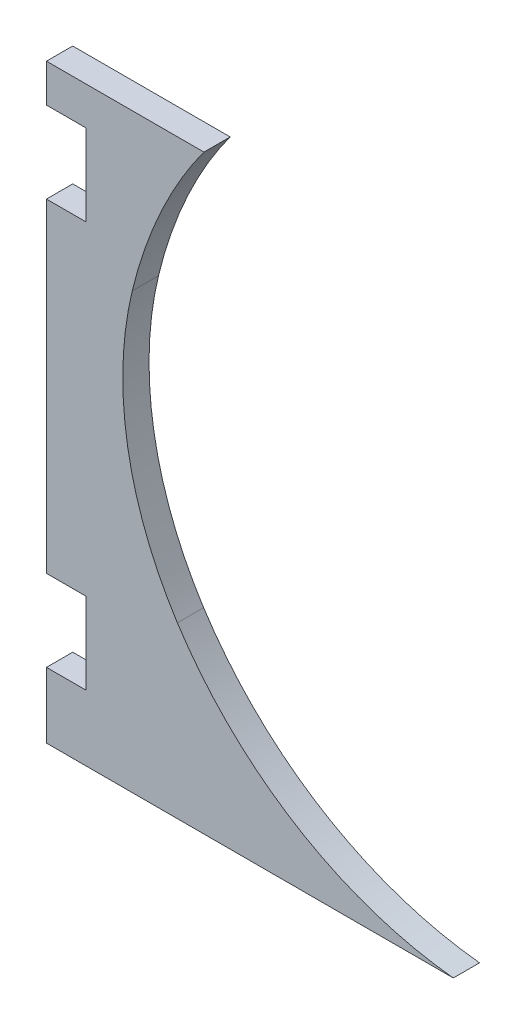
ISO-10303-21;
HEADER;
FILE_DESCRIPTION(('STEP AP214'),'2;1');
FILE_NAME('part.step','',(''),(''),'','','');
FILE_SCHEMA(('AUTOMOTIVE_DESIGN { 1 0 10303 214 1 1 1 1 }'));
ENDSEC;
DATA;
#1=APPLICATION_CONTEXT('core data for automotive mechanical design processes');
#2=APPLICATION_PROTOCOL_DEFINITION('international standard','automotive_design',2000,#1);
#3=PRODUCT_CONTEXT('',#1,'mechanical');
#4=PRODUCT('Part','Part','',(#3));
#5=PRODUCT_RELATED_PRODUCT_CATEGORY('part','',(#4));
#6=PRODUCT_DEFINITION_FORMATION('','',#4);
#7=PRODUCT_DEFINITION_CONTEXT('part definition',#1,'design');
#8=PRODUCT_DEFINITION('design','',#6,#7);
#9=PRODUCT_DEFINITION_SHAPE('','',#8);
#10=(LENGTH_UNIT() NAMED_UNIT(*) SI_UNIT(.MILLI.,.METRE.));
#11=(NAMED_UNIT(*) PLANE_ANGLE_UNIT() SI_UNIT($,.RADIAN.));
#12=(NAMED_UNIT(*) SI_UNIT($,.STERADIAN.) SOLID_ANGLE_UNIT());
#13=UNCERTAINTY_MEASURE_WITH_UNIT(LENGTH_MEASURE(1.E-05),#10,'distance_accuracy_value','');
#14=(GEOMETRIC_REPRESENTATION_CONTEXT(3) GLOBAL_UNCERTAINTY_ASSIGNED_CONTEXT((#13)) GLOBAL_UNIT_ASSIGNED_CONTEXT((#10,
#11,#12)) REPRESENTATION_CONTEXT('',''));
#15=CARTESIAN_POINT('',(0.,0.,0.));
#16=DIRECTION('',(0.,0.,1.));
#17=DIRECTION('',(1.,0.,0.));
#18=AXIS2_PLACEMENT_3D('',#15,#16,#17);
#19=CARTESIAN_POINT('',(-85.,0.,0.));
#20=DIRECTION('',(-1.,0.,0.));
#21=DIRECTION('',(0.,-1.,0.));
#22=AXIS2_PLACEMENT_3D('',#19,#20,#21);
#23=PLANE('',#22);
#24=DIRECTION('',(0.,0.,-1.));
#25=VECTOR('',#24,1.);
#26=CARTESIAN_POINT('',(-85.,67.,10.));
#27=LINE('',#26,#25);
#28=CARTESIAN_POINT('',(-85.,67.,10.));
#29=VERTEX_POINT('',#28);
#30=CARTESIAN_POINT('',(-85.,67.,0.));
#31=VERTEX_POINT('',#30);
#32=EDGE_CURVE('E165',#29,#31,#27,.T.);
#33=ORIENTED_EDGE('',*,*,#32,.T.);
#34=DIRECTION('',(0.,-1.,0.));
#35=VECTOR('',#34,1.);
#36=CARTESIAN_POINT('',(-85.,112.5,0.));
#37=LINE('',#36,#35);
#38=CARTESIAN_POINT('',(-85.,-56.5,0.));
#39=VERTEX_POINT('',#38);
#40=EDGE_CURVE('E198',#31,#39,#37,.T.);
#41=ORIENTED_EDGE('',*,*,#40,.T.);
#42=DIRECTION('',(0.,0.,-1.));
#43=VECTOR('',#42,1.);
#44=CARTESIAN_POINT('',(-85.,-56.5,10.));
#45=LINE('',#44,#43);
#46=CARTESIAN_POINT('',(-85.,-56.5,10.));
#47=VERTEX_POINT('',#46);
#48=EDGE_CURVE('E179',#47,#39,#45,.T.);
#49=ORIENTED_EDGE('',*,*,#48,.F.);
#50=DIRECTION('',(0.,1.,0.));
#51=VECTOR('',#50,1.);
#52=CARTESIAN_POINT('',(-85.,112.5,10.));
#53=LINE('',#52,#51);
#54=EDGE_CURVE('E205',#47,#29,#53,.T.);
#55=ORIENTED_EDGE('',*,*,#54,.T.);
#56=EDGE_LOOP('',(#33,#41,#49,#55));
#57=FACE_BOUND('',#56,.T.);
#58=ADVANCED_FACE('F35',(#57),#23,.T.);
#59=DIRECTION('',(0.,0.,-1.));
#60=VECTOR('',#59,1.);
#61=CARTESIAN_POINT('',(-85.,-87.5,10.));
#62=LINE('',#61,#60);
#63=CARTESIAN_POINT('',(-85.,-87.5,10.));
#64=VERTEX_POINT('',#63);
#65=CARTESIAN_POINT('',(-85.,-87.5,0.));
#66=VERTEX_POINT('',#65);
#67=EDGE_CURVE('E163',#64,#66,#62,.T.);
#68=ORIENTED_EDGE('',*,*,#67,.T.);
#69=CARTESIAN_POINT('',(-85.,-112.5,0.));
#70=VERTEX_POINT('',#69);
#71=EDGE_CURVE('E168',#66,#70,#37,.T.);
#72=ORIENTED_EDGE('',*,*,#71,.T.);
#73=DIRECTION('',(0.,0.,1.));
#74=VECTOR('',#73,1.);
#75=CARTESIAN_POINT('',(-85.,-112.5,0.));
#76=LINE('',#75,#74);
#77=CARTESIAN_POINT('',(-85.,-112.5,10.));
#78=VERTEX_POINT('',#77);
#79=EDGE_CURVE('E197',#70,#78,#76,.T.);
#80=ORIENTED_EDGE('',*,*,#79,.T.);
#81=EDGE_CURVE('E201',#78,#64,#53,.T.);
#82=ORIENTED_EDGE('',*,*,#81,.T.);
#83=EDGE_LOOP('',(#68,#72,#80,#82));
#84=FACE_BOUND('',#83,.T.);
#85=ADVANCED_FACE('F239',(#84),#23,.T.);
#86=CARTESIAN_POINT('',(-70.,112.5,10.));
#87=DIRECTION('',(0.,-1.,0.));
#88=DIRECTION('',(0.,0.,-1.));
#89=AXIS2_PLACEMENT_3D('',#86,#87,#88);
#90=PLANE('',#89);
#91=DIRECTION('',(0.,0.,1.));
#92=VECTOR('',#91,1.);
#93=CARTESIAN_POINT('',(-25.,112.5,0.));
#94=LINE('',#93,#92);
#95=CARTESIAN_POINT('',(-25.,112.5,0.));
#96=VERTEX_POINT('',#95);
#97=CARTESIAN_POINT('',(-25.,112.5,10.));
#98=VERTEX_POINT('',#97);
#99=EDGE_CURVE('E308',#96,#98,#94,.T.);
#100=ORIENTED_EDGE('',*,*,#99,.F.);
#101=DIRECTION('',(-1.,0.,0.));
#102=VECTOR('',#101,1.);
#103=CARTESIAN_POINT('',(-70.,112.5,0.));
#104=LINE('',#103,#102);
#105=CARTESIAN_POINT('',(-85.,112.5,0.));
#106=VERTEX_POINT('',#105);
#107=EDGE_CURVE('E288',#96,#106,#104,.T.);
#108=ORIENTED_EDGE('',*,*,#107,.T.);
#109=DIRECTION('',(0.,0.,-1.));
#110=VECTOR('',#109,1.);
#111=CARTESIAN_POINT('',(-85.,112.5,0.));
#112=LINE('',#111,#110);
#113=CARTESIAN_POINT('',(-85.,112.5,10.));
#114=VERTEX_POINT('',#113);
#115=EDGE_CURVE('E204',#114,#106,#112,.T.);
#116=ORIENTED_EDGE('',*,*,#115,.F.);
#117=DIRECTION('',(-1.,0.,0.));
#118=VECTOR('',#117,1.);
#119=CARTESIAN_POINT('',(-70.,112.5,10.));
#120=LINE('',#119,#118);
#121=EDGE_CURVE('E287',#98,#114,#120,.T.);
#122=ORIENTED_EDGE('',*,*,#121,.F.);
#123=EDGE_LOOP('',(#100,#108,#116,#122));
#124=FACE_BOUND('',#123,.T.);
#125=ADVANCED_FACE('F236',(#124),#90,.F.);
#126=CARTESIAN_POINT('',(-70.,-112.5,10.));
#127=DIRECTION('',(0.,1.,0.));
#128=DIRECTION('',(0.,0.,1.));
#129=AXIS2_PLACEMENT_3D('',#126,#127,#128);
#130=PLANE('',#129);
#131=DIRECTION('',(1.,0.,0.));
#132=VECTOR('',#131,1.);
#133=CARTESIAN_POINT('',(-70.,-112.5,0.));
#134=LINE('',#133,#132);
#135=CARTESIAN_POINT('',(70.,-112.5,0.));
#136=VERTEX_POINT('',#135);
#137=EDGE_CURVE('E283',#70,#136,#134,.T.);
#138=ORIENTED_EDGE('',*,*,#137,.T.);
#139=DIRECTION('',(0.,0.,-1.));
#140=VECTOR('',#139,1.);
#141=CARTESIAN_POINT('',(70.,-112.5,10.));
#142=LINE('',#141,#140);
#143=CARTESIAN_POINT('',(70.,-112.5,10.));
#144=VERTEX_POINT('',#143);
#145=EDGE_CURVE('E293',#144,#136,#142,.T.);
#146=ORIENTED_EDGE('',*,*,#145,.F.);
#147=DIRECTION('',(1.,0.,0.));
#148=VECTOR('',#147,1.);
#149=CARTESIAN_POINT('',(-70.,-112.5,10.));
#150=LINE('',#149,#148);
#151=EDGE_CURVE('E291',#78,#144,#150,.T.);
#152=ORIENTED_EDGE('',*,*,#151,.F.);
#153=ORIENTED_EDGE('',*,*,#79,.F.);
#154=EDGE_LOOP('',(#138,#146,#152,#153));
#155=FACE_BOUND('',#154,.T.);
#156=ADVANCED_FACE('F231',(#155),#130,.F.);
#157=CARTESIAN_POINT('',(0.,0.,10.));
#158=DIRECTION('',(0.,0.,1.));
#159=DIRECTION('',(1.,0.,0.));
#160=AXIS2_PLACEMENT_3D('',#157,#158,#159);
#161=PLANE('',#160);
#162=DIRECTION('',(-1.,0.,0.));
#163=VECTOR('',#162,1.);
#164=CARTESIAN_POINT('',(-85.,67.,10.));
#165=LINE('',#164,#163);
#166=CARTESIAN_POINT('',(-70.,67.,10.));
#167=VERTEX_POINT('',#166);
#168=EDGE_CURVE('E150',#167,#29,#165,.T.);
#169=ORIENTED_EDGE('',*,*,#168,.T.);
#170=ORIENTED_EDGE('',*,*,#54,.F.);
#171=DIRECTION('',(1.,0.,0.));
#172=VECTOR('',#171,1.);
#173=CARTESIAN_POINT('',(-85.,-56.5,10.));
#174=LINE('',#173,#172);
#175=CARTESIAN_POINT('',(-70.,-56.5,10.));
#176=VERTEX_POINT('',#175);
#177=EDGE_CURVE('E58',#47,#176,#174,.T.);
#178=ORIENTED_EDGE('',*,*,#177,.T.);
#179=DIRECTION('',(0.,-1.,0.));
#180=VECTOR('',#179,1.);
#181=CARTESIAN_POINT('',(-70.,-87.5,10.));
#182=LINE('',#181,#180);
#183=CARTESIAN_POINT('',(-70.,-87.5,10.));
#184=VERTEX_POINT('',#183);
#185=EDGE_CURVE('E172',#176,#184,#182,.T.);
#186=ORIENTED_EDGE('',*,*,#185,.T.);
#187=DIRECTION('',(-1.,0.,0.));
#188=VECTOR('',#187,1.);
#189=CARTESIAN_POINT('',(-85.,-87.5,10.));
#190=LINE('',#189,#188);
#191=EDGE_CURVE('E176',#184,#64,#190,.T.);
#192=ORIENTED_EDGE('',*,*,#191,.T.);
#193=ORIENTED_EDGE('',*,*,#81,.F.);
#194=ORIENTED_EDGE('',*,*,#151,.T.);
#195=CARTESIAN_POINT('',(85.,29.7111106770494,10.));
#196=DIRECTION('',(0.,0.,1.));
#197=DIRECTION('',(1.,0.,0.));
#198=AXIS2_PLACEMENT_3D('',#195,#196,#197);
#199=CIRCLE('',#198,143.);
#200=CARTESIAN_POINT('',(-35.1225721519482,-47.8747621323738,10.));
#201=VERTEX_POINT('',#200);
#202=EDGE_CURVE('E215',#144,#201,#199,.F.);
#203=ORIENTED_EDGE('',*,*,#202,.T.);
#204=CARTESIAN_POINT('',(74.0797661680048,22.6578495125565,10.));
#205=DIRECTION('',(0.,0.,1.));
#206=DIRECTION('',(1.,0.,0.));
#207=AXIS2_PLACEMENT_3D('',#204,#205,#206);
#208=CIRCLE('',#207,130.);
#209=CARTESIAN_POINT('',(-52.3162460247783,53.0560090252942,10.));
#210=VERTEX_POINT('',#209);
#211=EDGE_CURVE('E43',#201,#210,#208,.F.);
#212=ORIENTED_EDGE('',*,*,#211,.T.);
#213=CARTESIAN_POINT('',(-57.,12.8291676609155,10.));
#214=CARTESIAN_POINT('',(-57.2309205030265,51.9086363712916,10.));
#215=CARTESIAN_POINT('',(-43.4995555680376,87.4349379537387,10.));
#216=CARTESIAN_POINT('',(-25.,112.5,10.));
#217=B_SPLINE_CURVE_WITH_KNOTS('',3,(#213,#214,#215,#216),.UNSPECIFIED.,.F.,.F.,(4,4),(0.,1.),.UNSPECIFIED.);
#218=EDGE_CURVE('E208',#210,#98,#217,.T.);
#219=ORIENTED_EDGE('',*,*,#218,.T.);
#220=ORIENTED_EDGE('',*,*,#121,.T.);
#221=CARTESIAN_POINT('',(-85.,98.,10.));
#222=VERTEX_POINT('',#221);
#223=EDGE_CURVE('E155',#222,#114,#53,.T.);
#224=ORIENTED_EDGE('',*,*,#223,.F.);
#225=DIRECTION('',(1.,0.,0.));
#226=VECTOR('',#225,1.);
#227=CARTESIAN_POINT('',(-85.,98.,10.));
#228=LINE('',#227,#226);
#229=CARTESIAN_POINT('',(-70.,98.,10.));
#230=VERTEX_POINT('',#229);
#231=EDGE_CURVE('E50',#222,#230,#228,.T.);
#232=ORIENTED_EDGE('',*,*,#231,.T.);
#233=DIRECTION('',(0.,-1.,0.));
#234=VECTOR('',#233,1.);
#235=CARTESIAN_POINT('',(-70.,98.,10.));
#236=LINE('',#235,#234);
#237=EDGE_CURVE('E145',#230,#167,#236,.T.);
#238=ORIENTED_EDGE('',*,*,#237,.T.);
#239=EDGE_LOOP('',(#169,#170,#178,#186,#192,#193,#194,#203,#212,#219,#220,#224,#232,#238));
#240=FACE_BOUND('',#239,.T.);
#241=ADVANCED_FACE('F153',(#240),#161,.T.);
#242=CARTESIAN_POINT('',(0.,0.,0.));
#243=DIRECTION('',(0.,0.,1.));
#244=DIRECTION('',(1.,0.,0.));
#245=AXIS2_PLACEMENT_3D('',#242,#243,#244);
#246=PLANE('',#245);
#247=ORIENTED_EDGE('',*,*,#40,.F.);
#248=DIRECTION('',(-1.,0.,0.));
#249=VECTOR('',#248,1.);
#250=CARTESIAN_POINT('',(-85.,67.,0.));
#251=LINE('',#250,#249);
#252=CARTESIAN_POINT('',(-70.,67.,0.));
#253=VERTEX_POINT('',#252);
#254=EDGE_CURVE('E156',#253,#31,#251,.T.);
#255=ORIENTED_EDGE('',*,*,#254,.F.);
#256=DIRECTION('',(0.,-1.,0.));
#257=VECTOR('',#256,1.);
#258=CARTESIAN_POINT('',(-70.,98.,0.));
#259=LINE('',#258,#257);
#260=CARTESIAN_POINT('',(-70.,98.,0.));
#261=VERTEX_POINT('',#260);
#262=EDGE_CURVE('E158',#261,#253,#259,.T.);
#263=ORIENTED_EDGE('',*,*,#262,.F.);
#264=DIRECTION('',(1.,0.,0.));
#265=VECTOR('',#264,1.);
#266=CARTESIAN_POINT('',(-85.,98.,0.));
#267=LINE('',#266,#265);
#268=CARTESIAN_POINT('',(-85.,98.,0.));
#269=VERTEX_POINT('',#268);
#270=EDGE_CURVE('E137',#269,#261,#267,.T.);
#271=ORIENTED_EDGE('',*,*,#270,.F.);
#272=EDGE_CURVE('E194',#106,#269,#37,.T.);
#273=ORIENTED_EDGE('',*,*,#272,.F.);
#274=ORIENTED_EDGE('',*,*,#107,.F.);
#275=CARTESIAN_POINT('',(-57.,12.8291676609155,0.));
#276=CARTESIAN_POINT('',(-57.2309205030265,51.9086363712916,0.));
#277=CARTESIAN_POINT('',(-43.4995555680376,87.4349379537387,0.));
#278=CARTESIAN_POINT('',(-25.,112.5,0.));
#279=B_SPLINE_CURVE_WITH_KNOTS('',3,(#275,#276,#277,#278),.UNSPECIFIED.,.F.,.F.,(4,4),(0.,1.),.UNSPECIFIED.);
#280=CARTESIAN_POINT('',(-52.3162460247783,53.0560090252942,0.));
#281=VERTEX_POINT('',#280);
#282=EDGE_CURVE('E209',#281,#96,#279,.T.);
#283=ORIENTED_EDGE('',*,*,#282,.F.);
#284=CARTESIAN_POINT('',(74.0797661680048,22.6578495125565,0.));
#285=DIRECTION('',(0.,0.,1.));
#286=DIRECTION('',(1.,0.,0.));
#287=AXIS2_PLACEMENT_3D('',#284,#285,#286);
#288=CIRCLE('',#287,130.);
#289=CARTESIAN_POINT('',(-35.1225721519482,-47.8747621323738,0.));
#290=VERTEX_POINT('',#289);
#291=EDGE_CURVE('E11',#281,#290,#288,.T.);
#292=ORIENTED_EDGE('',*,*,#291,.T.);
#293=CARTESIAN_POINT('',(85.,29.7111106770494,0.));
#294=DIRECTION('',(0.,0.,1.));
#295=DIRECTION('',(1.,0.,0.));
#296=AXIS2_PLACEMENT_3D('',#293,#294,#295);
#297=CIRCLE('',#296,143.);
#298=EDGE_CURVE('E214',#136,#290,#297,.F.);
#299=ORIENTED_EDGE('',*,*,#298,.F.);
#300=ORIENTED_EDGE('',*,*,#137,.F.);
#301=ORIENTED_EDGE('',*,*,#71,.F.);
#302=DIRECTION('',(-1.,0.,0.));
#303=VECTOR('',#302,1.);
#304=CARTESIAN_POINT('',(-85.,-87.5,0.));
#305=LINE('',#304,#303);
#306=CARTESIAN_POINT('',(-70.,-87.5,0.));
#307=VERTEX_POINT('',#306);
#308=EDGE_CURVE('E173',#307,#66,#305,.T.);
#309=ORIENTED_EDGE('',*,*,#308,.F.);
#310=DIRECTION('',(0.,-1.,0.));
#311=VECTOR('',#310,1.);
#312=CARTESIAN_POINT('',(-70.,-87.5,0.));
#313=LINE('',#312,#311);
#314=CARTESIAN_POINT('',(-70.,-56.5,0.));
#315=VERTEX_POINT('',#314);
#316=EDGE_CURVE('E183',#315,#307,#313,.T.);
#317=ORIENTED_EDGE('',*,*,#316,.F.);
#318=DIRECTION('',(1.,0.,0.));
#319=VECTOR('',#318,1.);
#320=CARTESIAN_POINT('',(-85.,-56.5,0.));
#321=LINE('',#320,#319);
#322=EDGE_CURVE('E180',#39,#315,#321,.T.);
#323=ORIENTED_EDGE('',*,*,#322,.F.);
#324=EDGE_LOOP('',(#247,#255,#263,#271,#273,#274,#283,#292,#299,#300,#301,#309,#317,#323));
#325=FACE_BOUND('',#324,.T.);
#326=ADVANCED_FACE('F226',(#325),#246,.F.);
#327=DIRECTION('',(0.,0.,1.));
#328=VECTOR('',#327,1.);
#329=SURFACE_OF_LINEAR_EXTRUSION('',#279,#328);
#330=ORIENTED_EDGE('',*,*,#218,.F.);
#331=DIRECTION('',(0.,0.,1.));
#332=VECTOR('',#331,1.);
#333=CARTESIAN_POINT('',(-52.3162460247782,53.0560090252942,10.));
#334=LINE('',#333,#332);
#335=EDGE_CURVE('E299',#210,#281,#334,.F.);
#336=ORIENTED_EDGE('',*,*,#335,.T.);
#337=ORIENTED_EDGE('',*,*,#282,.T.);
#338=ORIENTED_EDGE('',*,*,#99,.T.);
#339=EDGE_LOOP('',(#330,#336,#337,#338));
#340=FACE_BOUND('',#339,.T.);
#341=ADVANCED_FACE('F221',(#340),#329,.T.);
#342=CARTESIAN_POINT('',(85.,29.7111106770494,0.));
#343=DIRECTION('',(0.,0.,1.));
#344=DIRECTION('',(1.,0.,0.));
#345=AXIS2_PLACEMENT_3D('',#342,#343,#344);
#346=CYLINDRICAL_SURFACE('',#345,143.);
#347=ORIENTED_EDGE('',*,*,#298,.T.);
#348=DIRECTION('',(0.,0.,1.));
#349=VECTOR('',#348,1.);
#350=CARTESIAN_POINT('',(-35.1225721519482,-47.8747621323738,0.));
#351=LINE('',#350,#349);
#352=EDGE_CURVE('E296',#290,#201,#351,.T.);
#353=ORIENTED_EDGE('',*,*,#352,.T.);
#354=ORIENTED_EDGE('',*,*,#202,.F.);
#355=ORIENTED_EDGE('',*,*,#145,.T.);
#356=EDGE_LOOP('',(#347,#353,#354,#355));
#357=FACE_BOUND('',#356,.T.);
#358=ADVANCED_FACE('F225',(#357),#346,.F.);
#359=CARTESIAN_POINT('',(74.0797661680048,22.6578495125565,5.));
#360=DIRECTION('',(0.,0.,1.));
#361=DIRECTION('',(1.,0.,0.));
#362=AXIS2_PLACEMENT_3D('',#359,#360,#361);
#363=CYLINDRICAL_SURFACE('',#362,130.);
#364=ORIENTED_EDGE('',*,*,#291,.F.);
#365=ORIENTED_EDGE('',*,*,#335,.F.);
#366=ORIENTED_EDGE('',*,*,#211,.F.);
#367=ORIENTED_EDGE('',*,*,#352,.F.);
#368=EDGE_LOOP('',(#364,#365,#366,#367));
#369=FACE_BOUND('',#368,.T.);
#370=ADVANCED_FACE('F37',(#369),#363,.F.);
#371=DIRECTION('',(0.,0.,-1.));
#372=VECTOR('',#371,1.);
#373=CARTESIAN_POINT('',(-85.,98.,10.));
#374=LINE('',#373,#372);
#375=EDGE_CURVE('E142',#222,#269,#374,.T.);
#376=ORIENTED_EDGE('',*,*,#375,.F.);
#377=ORIENTED_EDGE('',*,*,#223,.T.);
#378=ORIENTED_EDGE('',*,*,#115,.T.);
#379=ORIENTED_EDGE('',*,*,#272,.T.);
#380=EDGE_LOOP('',(#376,#377,#378,#379));
#381=FACE_BOUND('',#380,.T.);
#382=ADVANCED_FACE('F245',(#381),#23,.T.);
#383=CARTESIAN_POINT('',(-85.,-87.5,10.));
#384=DIRECTION('',(0.,-1.,0.));
#385=DIRECTION('',(0.,0.,-1.));
#386=AXIS2_PLACEMENT_3D('',#383,#384,#385);
#387=PLANE('',#386);
#388=ORIENTED_EDGE('',*,*,#308,.T.);
#389=ORIENTED_EDGE('',*,*,#67,.F.);
#390=ORIENTED_EDGE('',*,*,#191,.F.);
#391=DIRECTION('',(0.,0.,-1.));
#392=VECTOR('',#391,1.);
#393=CARTESIAN_POINT('',(-70.,-87.5,10.));
#394=LINE('',#393,#392);
#395=EDGE_CURVE('E189',#184,#307,#394,.T.);
#396=ORIENTED_EDGE('',*,*,#395,.T.);
#397=EDGE_LOOP('',(#388,#389,#390,#396));
#398=FACE_BOUND('',#397,.T.);
#399=ADVANCED_FACE('F253',(#398),#387,.F.);
#400=CARTESIAN_POINT('',(-70.,-87.5,10.));
#401=DIRECTION('',(1.,0.,0.));
#402=DIRECTION('',(0.,0.,-1.));
#403=AXIS2_PLACEMENT_3D('',#400,#401,#402);
#404=PLANE('',#403);
#405=ORIENTED_EDGE('',*,*,#316,.T.);
#406=ORIENTED_EDGE('',*,*,#395,.F.);
#407=ORIENTED_EDGE('',*,*,#185,.F.);
#408=DIRECTION('',(0.,0.,-1.));
#409=VECTOR('',#408,1.);
#410=CARTESIAN_POINT('',(-70.,-56.5,10.));
#411=LINE('',#410,#409);
#412=EDGE_CURVE('E191',#176,#315,#411,.T.);
#413=ORIENTED_EDGE('',*,*,#412,.T.);
#414=EDGE_LOOP('',(#405,#406,#407,#413));
#415=FACE_BOUND('',#414,.T.);
#416=ADVANCED_FACE('F259',(#415),#404,.F.);
#417=CARTESIAN_POINT('',(-85.,-56.5,10.));
#418=DIRECTION('',(0.,1.,0.));
#419=DIRECTION('',(0.,0.,1.));
#420=AXIS2_PLACEMENT_3D('',#417,#418,#419);
#421=PLANE('',#420);
#422=ORIENTED_EDGE('',*,*,#322,.T.);
#423=ORIENTED_EDGE('',*,*,#412,.F.);
#424=ORIENTED_EDGE('',*,*,#177,.F.);
#425=ORIENTED_EDGE('',*,*,#48,.T.);
#426=EDGE_LOOP('',(#422,#423,#424,#425));
#427=FACE_BOUND('',#426,.T.);
#428=ADVANCED_FACE('F384',(#427),#421,.F.);
#429=CARTESIAN_POINT('',(-85.,67.,10.));
#430=DIRECTION('',(0.,-1.,0.));
#431=DIRECTION('',(0.,0.,-1.));
#432=AXIS2_PLACEMENT_3D('',#429,#430,#431);
#433=PLANE('',#432);
#434=ORIENTED_EDGE('',*,*,#254,.T.);
#435=ORIENTED_EDGE('',*,*,#32,.F.);
#436=ORIENTED_EDGE('',*,*,#168,.F.);
#437=DIRECTION('',(0.,0.,-1.));
#438=VECTOR('',#437,1.);
#439=CARTESIAN_POINT('',(-70.,67.,10.));
#440=LINE('',#439,#438);
#441=EDGE_CURVE('E141',#167,#253,#440,.T.);
#442=ORIENTED_EDGE('',*,*,#441,.T.);
#443=EDGE_LOOP('',(#434,#435,#436,#442));
#444=FACE_BOUND('',#443,.T.);
#445=ADVANCED_FACE('F270',(#444),#433,.F.);
#446=CARTESIAN_POINT('',(-70.,98.,10.));
#447=DIRECTION('',(1.,0.,0.));
#448=DIRECTION('',(0.,0.,-1.));
#449=AXIS2_PLACEMENT_3D('',#446,#447,#448);
#450=PLANE('',#449);
#451=ORIENTED_EDGE('',*,*,#262,.T.);
#452=ORIENTED_EDGE('',*,*,#441,.F.);
#453=ORIENTED_EDGE('',*,*,#237,.F.);
#454=DIRECTION('',(0.,0.,-1.));
#455=VECTOR('',#454,1.);
#456=CARTESIAN_POINT('',(-70.,98.,10.));
#457=LINE('',#456,#455);
#458=EDGE_CURVE('E133',#230,#261,#457,.T.);
#459=ORIENTED_EDGE('',*,*,#458,.T.);
#460=EDGE_LOOP('',(#451,#452,#453,#459));
#461=FACE_BOUND('',#460,.T.);
#462=ADVANCED_FACE('F146',(#461),#450,.F.);
#463=CARTESIAN_POINT('',(-85.,98.,10.));
#464=DIRECTION('',(0.,1.,0.));
#465=DIRECTION('',(-1.,0.,0.));
#466=AXIS2_PLACEMENT_3D('',#463,#464,#465);
#467=PLANE('',#466);
#468=ORIENTED_EDGE('',*,*,#270,.T.);
#469=ORIENTED_EDGE('',*,*,#458,.F.);
#470=ORIENTED_EDGE('',*,*,#231,.F.);
#471=ORIENTED_EDGE('',*,*,#375,.T.);
#472=EDGE_LOOP('',(#468,#469,#470,#471));
#473=FACE_BOUND('',#472,.T.);
#474=ADVANCED_FACE('F135',(#473),#467,.F.);
#475=CLOSED_SHELL('',(#58,#85,#125,#156,#241,#326,#341,#358,#370,#382,#399,#416,#428,#445,#462,#474));
#476=MANIFOLD_SOLID_BREP('B2',#475);
#477=ADVANCED_BREP_SHAPE_REPRESENTATION('',(#18,#476),#14);
#478=SHAPE_DEFINITION_REPRESENTATION(#9,#477);
ENDSEC;
END-ISO-10303-21;
